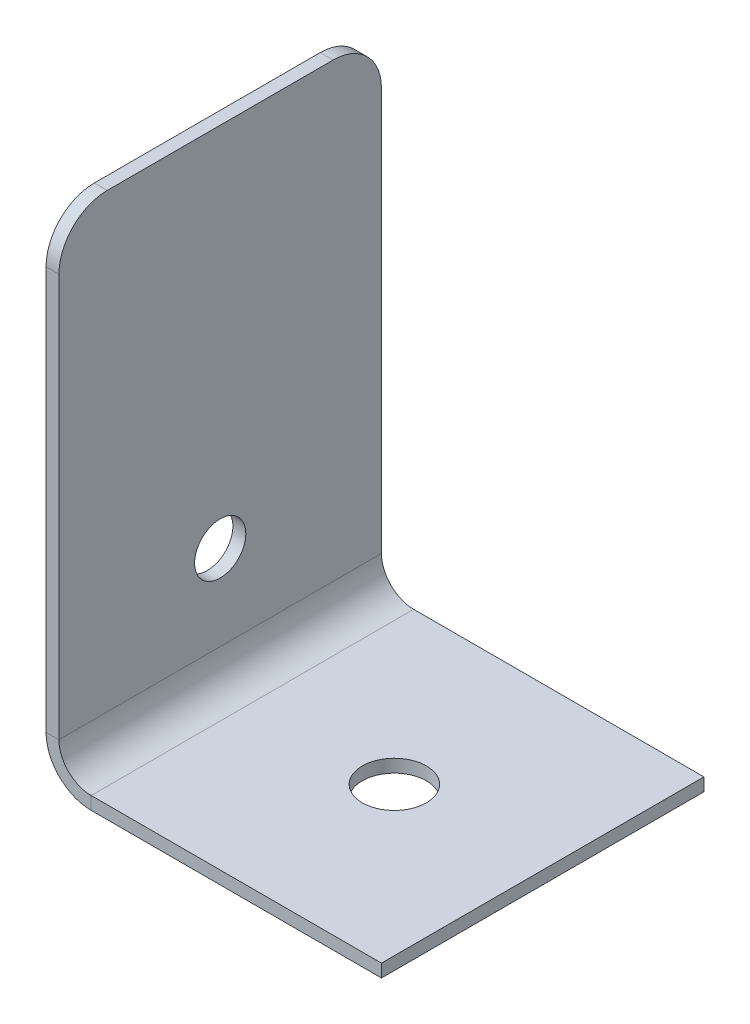
ISO-10303-21;
HEADER;
FILE_DESCRIPTION(('STEP AP214'),'2;1');
FILE_NAME('part.step','',(''),(''),'','','');
FILE_SCHEMA(('AUTOMOTIVE_DESIGN { 1 0 10303 214 1 1 1 1 }'));
ENDSEC;
DATA;
#1=APPLICATION_CONTEXT('core data for automotive mechanical design processes');
#2=APPLICATION_PROTOCOL_DEFINITION('international standard','automotive_design',2000,#1);
#3=PRODUCT_CONTEXT('',#1,'mechanical');
#4=PRODUCT('Part','Part','',(#3));
#5=PRODUCT_RELATED_PRODUCT_CATEGORY('part','',(#4));
#6=PRODUCT_DEFINITION_FORMATION('','',#4);
#7=PRODUCT_DEFINITION_CONTEXT('part definition',#1,'design');
#8=PRODUCT_DEFINITION('design','',#6,#7);
#9=PRODUCT_DEFINITION_SHAPE('','',#8);
#10=(LENGTH_UNIT() NAMED_UNIT(*) SI_UNIT(.MILLI.,.METRE.));
#11=(NAMED_UNIT(*) PLANE_ANGLE_UNIT() SI_UNIT($,.RADIAN.));
#12=(NAMED_UNIT(*) SI_UNIT($,.STERADIAN.) SOLID_ANGLE_UNIT());
#13=UNCERTAINTY_MEASURE_WITH_UNIT(LENGTH_MEASURE(1.E-05),#10,'distance_accuracy_value','');
#14=(GEOMETRIC_REPRESENTATION_CONTEXT(3) GLOBAL_UNCERTAINTY_ASSIGNED_CONTEXT((#13)) GLOBAL_UNIT_ASSIGNED_CONTEXT((#10,
#11,#12)) REPRESENTATION_CONTEXT('',''));
#15=CARTESIAN_POINT('',(0.,0.,0.));
#16=DIRECTION('',(0.,0.,1.));
#17=DIRECTION('',(1.,0.,0.));
#18=AXIS2_PLACEMENT_3D('',#15,#16,#17);
#19=CARTESIAN_POINT('',(2.00000000000001,0.,9.99999999999999));
#20=DIRECTION('',(0.,0.,1.));
#21=DIRECTION('',(1.,0.,0.));
#22=AXIS2_PLACEMENT_3D('',#19,#20,#21);
#23=PLANE('',#22);
#24=DIRECTION('',(0.,-1.,0.));
#25=VECTOR('',#24,1.);
#26=CARTESIAN_POINT('',(2.00000000000001,0.,9.99999999999999));
#27=LINE('',#26,#25);
#28=CARTESIAN_POINT('',(2.00000000000001,0.,9.99999999999999));
#29=VERTEX_POINT('',#28);
#30=CARTESIAN_POINT('',(2.00000000000001,-0.799999999999998,9.99999999999999));
#31=VERTEX_POINT('',#30);
#32=EDGE_CURVE('E197',#29,#31,#27,.T.);
#33=ORIENTED_EDGE('',*,*,#32,.F.);
#34=CARTESIAN_POINT('',(2.00000000000001,2.,9.99999999999999));
#35=DIRECTION('',(0.,0.,-1.));
#36=DIRECTION('',(-1.,0.,0.));
#37=AXIS2_PLACEMENT_3D('',#34,#35,#36);
#38=CIRCLE('',#37,2.);
#39=CARTESIAN_POINT('',(0.,2.,9.99999999999999));
#40=VERTEX_POINT('',#39);
#41=EDGE_CURVE('E165',#40,#29,#38,.F.);
#42=ORIENTED_EDGE('',*,*,#41,.F.);
#43=DIRECTION('',(1.,0.,0.));
#44=VECTOR('',#43,1.);
#45=CARTESIAN_POINT('',(-0.799999999999999,2.,9.99999999999999));
#46=LINE('',#45,#44);
#47=CARTESIAN_POINT('',(-0.799999999999999,2.,9.99999999999999));
#48=VERTEX_POINT('',#47);
#49=EDGE_CURVE('E194',#48,#40,#46,.T.);
#50=ORIENTED_EDGE('',*,*,#49,.F.);
#51=CARTESIAN_POINT('',(2.00000000000001,2.,9.99999999999999));
#52=DIRECTION('',(0.,0.,1.));
#53=DIRECTION('',(1.,0.,0.));
#54=AXIS2_PLACEMENT_3D('',#51,#52,#53);
#55=CIRCLE('',#54,2.8);
#56=EDGE_CURVE('E172',#48,#31,#55,.T.);
#57=ORIENTED_EDGE('',*,*,#56,.T.);
#58=EDGE_LOOP('',(#33,#42,#50,#57));
#59=FACE_BOUND('',#58,.T.);
#60=ADVANCED_FACE('F38',(#59),#23,.T.);
#61=CARTESIAN_POINT('',(-0.799999999999999,2.,9.99999999999999));
#62=DIRECTION('',(0.,0.,1.));
#63=DIRECTION('',(1.,0.,0.));
#64=AXIS2_PLACEMENT_3D('',#61,#62,#63);
#65=PLANE('',#64);
#66=DIRECTION('',(1.,0.,0.));
#67=VECTOR('',#66,1.);
#68=CARTESIAN_POINT('',(0.,0.,9.99999999999999));
#69=LINE('',#68,#67);
#70=CARTESIAN_POINT('',(20.,0.,10.));
#71=VERTEX_POINT('',#70);
#72=EDGE_CURVE('E162',#29,#71,#69,.T.);
#73=ORIENTED_EDGE('',*,*,#72,.F.);
#74=ORIENTED_EDGE('',*,*,#32,.T.);
#75=DIRECTION('',(1.,0.,0.));
#76=VECTOR('',#75,1.);
#77=CARTESIAN_POINT('',(0.,-0.8,9.99999999999999));
#78=LINE('',#77,#76);
#79=CARTESIAN_POINT('',(20.,-0.799999999999988,10.));
#80=VERTEX_POINT('',#79);
#81=EDGE_CURVE('E159',#31,#80,#78,.T.);
#82=ORIENTED_EDGE('',*,*,#81,.T.);
#83=DIRECTION('',(0.,-1.,0.));
#84=VECTOR('',#83,1.);
#85=CARTESIAN_POINT('',(20.,0.,10.));
#86=LINE('',#85,#84);
#87=EDGE_CURVE('E122',#71,#80,#86,.T.);
#88=ORIENTED_EDGE('',*,*,#87,.F.);
#89=EDGE_LOOP('',(#73,#74,#82,#88));
#90=FACE_BOUND('',#89,.T.);
#91=ADVANCED_FACE('F244',(#90),#65,.T.);
#92=CARTESIAN_POINT('',(0.,2.,-9.99999999999999));
#93=DIRECTION('',(0.,0.,-1.));
#94=DIRECTION('',(-1.,0.,0.));
#95=AXIS2_PLACEMENT_3D('',#92,#93,#94);
#96=PLANE('',#95);
#97=DIRECTION('',(-1.,0.,0.));
#98=VECTOR('',#97,1.);
#99=CARTESIAN_POINT('',(0.,2.,-9.99999999999999));
#100=LINE('',#99,#98);
#101=CARTESIAN_POINT('',(0.,2.,-9.99999999999999));
#102=VERTEX_POINT('',#101);
#103=CARTESIAN_POINT('',(-0.799999999999999,2.,-9.99999999999999));
#104=VERTEX_POINT('',#103);
#105=EDGE_CURVE('E191',#102,#104,#100,.T.);
#106=ORIENTED_EDGE('',*,*,#105,.F.);
#107=CARTESIAN_POINT('',(2.00000000000001,2.,-9.99999999999999));
#108=DIRECTION('',(0.,0.,-1.));
#109=DIRECTION('',(-1.,0.,0.));
#110=AXIS2_PLACEMENT_3D('',#107,#108,#109);
#111=CIRCLE('',#110,2.);
#112=CARTESIAN_POINT('',(2.00000000000001,0.,-9.99999999999999));
#113=VERTEX_POINT('',#112);
#114=EDGE_CURVE('E150',#102,#113,#111,.F.);
#115=ORIENTED_EDGE('',*,*,#114,.T.);
#116=DIRECTION('',(0.,1.,0.));
#117=VECTOR('',#116,1.);
#118=CARTESIAN_POINT('',(2.00000000000001,-0.799999999999999,-9.99999999999999));
#119=LINE('',#118,#117);
#120=CARTESIAN_POINT('',(2.00000000000001,-0.799999999999999,-9.99999999999999));
#121=VERTEX_POINT('',#120);
#122=EDGE_CURVE('E126',#121,#113,#119,.T.);
#123=ORIENTED_EDGE('',*,*,#122,.F.);
#124=CARTESIAN_POINT('',(2.00000000000001,2.,-9.99999999999999));
#125=DIRECTION('',(0.,0.,1.));
#126=DIRECTION('',(1.,0.,0.));
#127=AXIS2_PLACEMENT_3D('',#124,#125,#126);
#128=CIRCLE('',#127,2.8);
#129=EDGE_CURVE('E157',#104,#121,#128,.T.);
#130=ORIENTED_EDGE('',*,*,#129,.F.);
#131=EDGE_LOOP('',(#106,#115,#123,#130));
#132=FACE_BOUND('',#131,.T.);
#133=ADVANCED_FACE('F246',(#132),#96,.T.);
#134=CARTESIAN_POINT('',(2.00000000000001,-0.799999999999999,-9.99999999999999));
#135=DIRECTION('',(0.,0.,-1.));
#136=DIRECTION('',(-1.,0.,0.));
#137=AXIS2_PLACEMENT_3D('',#134,#135,#136);
#138=PLANE('',#137);
#139=DIRECTION('',(0.,-1.,0.));
#140=VECTOR('',#139,1.);
#141=CARTESIAN_POINT('',(-0.799999999999981,30.,-9.99999999999999));
#142=LINE('',#141,#140);
#143=CARTESIAN_POINT('',(-0.799999999999981,27.,-9.99999999999999));
#144=VERTEX_POINT('',#143);
#145=EDGE_CURVE('E155',#144,#104,#142,.T.);
#146=ORIENTED_EDGE('',*,*,#145,.F.);
#147=DIRECTION('',(1.,0.,0.));
#148=VECTOR('',#147,1.);
#149=CARTESIAN_POINT('',(2.00000000000003,27.,-9.99999999999999));
#150=LINE('',#149,#148);
#151=CARTESIAN_POINT('',(0.,27.,-9.99999999999999));
#152=VERTEX_POINT('',#151);
#153=EDGE_CURVE('E199',#144,#152,#150,.T.);
#154=ORIENTED_EDGE('',*,*,#153,.T.);
#155=DIRECTION('',(0.,-1.,0.));
#156=VECTOR('',#155,1.);
#157=CARTESIAN_POINT('',(0.,30.,-9.99999999999999));
#158=LINE('',#157,#156);
#159=EDGE_CURVE('E153',#152,#102,#158,.T.);
#160=ORIENTED_EDGE('',*,*,#159,.T.);
#161=ORIENTED_EDGE('',*,*,#105,.T.);
#162=EDGE_LOOP('',(#146,#154,#160,#161));
#163=FACE_BOUND('',#162,.T.);
#164=ADVANCED_FACE('F219',(#163),#138,.T.);
#165=CARTESIAN_POINT('',(0.,-0.8,9.99999999999999));
#166=DIRECTION('',(0.,1.,0.));
#167=DIRECTION('',(0.,0.,1.));
#168=AXIS2_PLACEMENT_3D('',#165,#166,#167);
#169=PLANE('',#168);
#170=CARTESIAN_POINT('',(10.8,-0.799999999999994,0.));
#171=DIRECTION('',(0.,1.,0.));
#172=DIRECTION('',(0.,0.,1.));
#173=AXIS2_PLACEMENT_3D('',#170,#171,#172);
#174=CIRCLE('',#173,1.984375);
#175=CARTESIAN_POINT('',(10.8,-0.799999999999994,1.984375));
#176=VERTEX_POINT('',#175);
#177=EDGE_CURVE('E435',#176,#176,#174,.T.);
#178=ORIENTED_EDGE('',*,*,#177,.T.);
#179=EDGE_LOOP('',(#178));
#180=FACE_BOUND('',#179,.T.);
#181=DIRECTION('',(0.,0.,-1.));
#182=VECTOR('',#181,1.);
#183=CARTESIAN_POINT('',(2.00000000000001,-0.799999999999998,9.99999999999999));
#184=LINE('',#183,#182);
#185=EDGE_CURVE('E141',#31,#121,#184,.T.);
#186=ORIENTED_EDGE('',*,*,#185,.T.);
#187=DIRECTION('',(1.,0.,0.));
#188=VECTOR('',#187,1.);
#189=CARTESIAN_POINT('',(0.,-0.800000000000001,-9.99999999999999));
#190=LINE('',#189,#188);
#191=CARTESIAN_POINT('',(20.,-0.799999999999989,-9.99999999999999));
#192=VERTEX_POINT('',#191);
#193=EDGE_CURVE('E133',#121,#192,#190,.T.);
#194=ORIENTED_EDGE('',*,*,#193,.T.);
#195=DIRECTION('',(0.,0.,-1.));
#196=VECTOR('',#195,1.);
#197=CARTESIAN_POINT('',(20.,-0.799999999999988,10.));
#198=LINE('',#197,#196);
#199=EDGE_CURVE('E117',#80,#192,#198,.T.);
#200=ORIENTED_EDGE('',*,*,#199,.F.);
#201=ORIENTED_EDGE('',*,*,#81,.F.);
#202=EDGE_LOOP('',(#186,#194,#200,#201));
#203=FACE_BOUND('',#202,.T.);
#204=ADVANCED_FACE('F139',(#180,#203),#169,.F.);
#205=CARTESIAN_POINT('',(20.,0.,10.));
#206=DIRECTION('',(1.,0.,0.));
#207=DIRECTION('',(0.,0.,-1.));
#208=AXIS2_PLACEMENT_3D('',#205,#206,#207);
#209=PLANE('',#208);
#210=ORIENTED_EDGE('',*,*,#199,.T.);
#211=DIRECTION('',(0.,-1.,0.));
#212=VECTOR('',#211,1.);
#213=CARTESIAN_POINT('',(20.,0.,-9.99999999999999));
#214=LINE('',#213,#212);
#215=CARTESIAN_POINT('',(20.,0.,-9.99999999999999));
#216=VERTEX_POINT('',#215);
#217=EDGE_CURVE('E120',#216,#192,#214,.T.);
#218=ORIENTED_EDGE('',*,*,#217,.F.);
#219=DIRECTION('',(0.,0.,-1.));
#220=VECTOR('',#219,1.);
#221=CARTESIAN_POINT('',(20.,0.,10.));
#222=LINE('',#221,#220);
#223=EDGE_CURVE('E127',#71,#216,#222,.T.);
#224=ORIENTED_EDGE('',*,*,#223,.F.);
#225=ORIENTED_EDGE('',*,*,#87,.T.);
#226=EDGE_LOOP('',(#210,#218,#224,#225));
#227=FACE_BOUND('',#226,.T.);
#228=ADVANCED_FACE('F119',(#227),#209,.T.);
#229=CARTESIAN_POINT('',(0.,0.,9.99999999999999));
#230=DIRECTION('',(0.,1.,0.));
#231=DIRECTION('',(0.,0.,1.));
#232=AXIS2_PLACEMENT_3D('',#229,#230,#231);
#233=PLANE('',#232);
#234=CARTESIAN_POINT('',(10.8,0.,0.));
#235=DIRECTION('',(0.,1.,0.));
#236=DIRECTION('',(0.,0.,1.));
#237=AXIS2_PLACEMENT_3D('',#234,#235,#236);
#238=CIRCLE('',#237,1.984375);
#239=CARTESIAN_POINT('',(10.8,0.,1.984375));
#240=VERTEX_POINT('',#239);
#241=EDGE_CURVE('E436',#240,#240,#238,.T.);
#242=ORIENTED_EDGE('',*,*,#241,.F.);
#243=EDGE_LOOP('',(#242));
#244=FACE_BOUND('',#243,.T.);
#245=ORIENTED_EDGE('',*,*,#223,.T.);
#246=DIRECTION('',(1.,0.,0.));
#247=VECTOR('',#246,1.);
#248=CARTESIAN_POINT('',(0.,0.,-9.99999999999999));
#249=LINE('',#248,#247);
#250=EDGE_CURVE('E136',#113,#216,#249,.T.);
#251=ORIENTED_EDGE('',*,*,#250,.F.);
#252=DIRECTION('',(0.,0.,-1.));
#253=VECTOR('',#252,1.);
#254=CARTESIAN_POINT('',(2.00000000000001,0.,9.99999999999999));
#255=LINE('',#254,#253);
#256=EDGE_CURVE('E186',#29,#113,#255,.T.);
#257=ORIENTED_EDGE('',*,*,#256,.F.);
#258=ORIENTED_EDGE('',*,*,#72,.T.);
#259=EDGE_LOOP('',(#245,#251,#257,#258));
#260=FACE_BOUND('',#259,.T.);
#261=ADVANCED_FACE('F243',(#244,#260),#233,.T.);
#262=CARTESIAN_POINT('',(2.00000000000001,2.,9.99999999999999));
#263=DIRECTION('',(0.,0.,-1.));
#264=DIRECTION('',(-1.,0.,0.));
#265=AXIS2_PLACEMENT_3D('',#262,#263,#264);
#266=CYLINDRICAL_SURFACE('',#265,2.);
#267=ORIENTED_EDGE('',*,*,#256,.T.);
#268=ORIENTED_EDGE('',*,*,#114,.F.);
#269=DIRECTION('',(0.,0.,-1.));
#270=VECTOR('',#269,1.);
#271=CARTESIAN_POINT('',(0.,2.,9.99999999999999));
#272=LINE('',#271,#270);
#273=EDGE_CURVE('E183',#40,#102,#272,.T.);
#274=ORIENTED_EDGE('',*,*,#273,.F.);
#275=ORIENTED_EDGE('',*,*,#41,.T.);
#276=EDGE_LOOP('',(#267,#268,#274,#275));
#277=FACE_BOUND('',#276,.T.);
#278=ADVANCED_FACE('F237',(#277),#266,.F.);
#279=CARTESIAN_POINT('',(0.,30.,9.99999999999999));
#280=DIRECTION('',(1.,0.,0.));
#281=DIRECTION('',(0.,1.,0.));
#282=AXIS2_PLACEMENT_3D('',#279,#280,#281);
#283=PLANE('',#282);
#284=CARTESIAN_POINT('',(0.,7.27,0.));
#285=DIRECTION('',(1.,0.,0.));
#286=DIRECTION('',(0.,1.,0.));
#287=AXIS2_PLACEMENT_3D('',#284,#285,#286);
#288=CIRCLE('',#287,1.5875);
#289=CARTESIAN_POINT('',(0.,8.8575,0.));
#290=VERTEX_POINT('',#289);
#291=EDGE_CURVE('E145',#290,#290,#288,.T.);
#292=ORIENTED_EDGE('',*,*,#291,.F.);
#293=EDGE_LOOP('',(#292));
#294=FACE_BOUND('',#293,.T.);
#295=ORIENTED_EDGE('',*,*,#159,.F.);
#296=CARTESIAN_POINT('',(0.,27.,-7.00000000000001));
#297=DIRECTION('',(1.,0.,0.));
#298=DIRECTION('',(0.,1.,0.));
#299=AXIS2_PLACEMENT_3D('',#296,#297,#298);
#300=CIRCLE('',#299,3.);
#301=CARTESIAN_POINT('',(0.,30.,-7.00000000000001));
#302=VERTEX_POINT('',#301);
#303=EDGE_CURVE('E204',#152,#302,#300,.T.);
#304=ORIENTED_EDGE('',*,*,#303,.T.);
#305=DIRECTION('',(0.,0.,-1.));
#306=VECTOR('',#305,1.);
#307=CARTESIAN_POINT('',(0.,30.,9.99999999999999));
#308=LINE('',#307,#306);
#309=CARTESIAN_POINT('',(0.,30.,7.00000000000001));
#310=VERTEX_POINT('',#309);
#311=EDGE_CURVE('E181',#310,#302,#308,.T.);
#312=ORIENTED_EDGE('',*,*,#311,.F.);
#313=CARTESIAN_POINT('',(0.,27.,7.00000000000001));
#314=DIRECTION('',(1.,0.,0.));
#315=DIRECTION('',(0.,1.,0.));
#316=AXIS2_PLACEMENT_3D('',#313,#314,#315);
#317=CIRCLE('',#316,3.);
#318=CARTESIAN_POINT('',(0.,27.,9.99999999999999));
#319=VERTEX_POINT('',#318);
#320=EDGE_CURVE('E202',#310,#319,#317,.T.);
#321=ORIENTED_EDGE('',*,*,#320,.T.);
#322=DIRECTION('',(0.,-1.,0.));
#323=VECTOR('',#322,1.);
#324=CARTESIAN_POINT('',(0.,30.,9.99999999999999));
#325=LINE('',#324,#323);
#326=EDGE_CURVE('E168',#319,#40,#325,.T.);
#327=ORIENTED_EDGE('',*,*,#326,.T.);
#328=ORIENTED_EDGE('',*,*,#273,.T.);
#329=EDGE_LOOP('',(#295,#304,#312,#321,#327,#328));
#330=FACE_BOUND('',#329,.T.);
#331=ADVANCED_FACE('F225',(#294,#330),#283,.T.);
#332=CARTESIAN_POINT('',(-0.799999999999981,30.,9.99999999999999));
#333=DIRECTION('',(0.,1.,0.));
#334=DIRECTION('',(0.,0.,1.));
#335=AXIS2_PLACEMENT_3D('',#332,#333,#334);
#336=PLANE('',#335);
#337=ORIENTED_EDGE('',*,*,#311,.T.);
#338=DIRECTION('',(1.,0.,0.));
#339=VECTOR('',#338,1.);
#340=CARTESIAN_POINT('',(-0.799999999999981,30.,-7.00000000000001));
#341=LINE('',#340,#339);
#342=CARTESIAN_POINT('',(-0.799999999999981,30.,-7.00000000000001));
#343=VERTEX_POINT('',#342);
#344=EDGE_CURVE('E59',#302,#343,#341,.F.);
#345=ORIENTED_EDGE('',*,*,#344,.T.);
#346=DIRECTION('',(0.,0.,-1.));
#347=VECTOR('',#346,1.);
#348=CARTESIAN_POINT('',(-0.799999999999981,30.,9.99999999999999));
#349=LINE('',#348,#347);
#350=CARTESIAN_POINT('',(-0.799999999999981,30.,7.00000000000001));
#351=VERTEX_POINT('',#350);
#352=EDGE_CURVE('E179',#351,#343,#349,.T.);
#353=ORIENTED_EDGE('',*,*,#352,.F.);
#354=DIRECTION('',(1.,0.,0.));
#355=VECTOR('',#354,1.);
#356=CARTESIAN_POINT('',(0.,30.,7.00000000000001));
#357=LINE('',#356,#355);
#358=EDGE_CURVE('E206',#351,#310,#357,.T.);
#359=ORIENTED_EDGE('',*,*,#358,.T.);
#360=EDGE_LOOP('',(#337,#345,#353,#359));
#361=FACE_BOUND('',#360,.T.);
#362=ADVANCED_FACE('F226',(#361),#336,.T.);
#363=CARTESIAN_POINT('',(-0.799999999999981,30.,9.99999999999999));
#364=DIRECTION('',(1.,0.,0.));
#365=DIRECTION('',(0.,1.,0.));
#366=AXIS2_PLACEMENT_3D('',#363,#364,#365);
#367=PLANE('',#366);
#368=CARTESIAN_POINT('',(-0.800000000000002,7.27,0.));
#369=DIRECTION('',(1.,0.,0.));
#370=DIRECTION('',(0.,1.,0.));
#371=AXIS2_PLACEMENT_3D('',#368,#369,#370);
#372=CIRCLE('',#371,1.5875);
#373=CARTESIAN_POINT('',(-0.800000000000001,8.8575,0.));
#374=VERTEX_POINT('',#373);
#375=EDGE_CURVE('E142',#374,#374,#372,.T.);
#376=ORIENTED_EDGE('',*,*,#375,.T.);
#377=EDGE_LOOP('',(#376));
#378=FACE_BOUND('',#377,.T.);
#379=ORIENTED_EDGE('',*,*,#352,.T.);
#380=CARTESIAN_POINT('',(-0.799999999999981,27.,-7.00000000000001));
#381=DIRECTION('',(1.,0.,0.));
#382=DIRECTION('',(0.,1.,0.));
#383=AXIS2_PLACEMENT_3D('',#380,#381,#382);
#384=CIRCLE('',#383,3.);
#385=EDGE_CURVE('E46',#343,#144,#384,.F.);
#386=ORIENTED_EDGE('',*,*,#385,.T.);
#387=ORIENTED_EDGE('',*,*,#145,.T.);
#388=DIRECTION('',(0.,0.,-1.));
#389=VECTOR('',#388,1.);
#390=CARTESIAN_POINT('',(-0.799999999999999,2.,9.99999999999999));
#391=LINE('',#390,#389);
#392=EDGE_CURVE('E176',#48,#104,#391,.T.);
#393=ORIENTED_EDGE('',*,*,#392,.F.);
#394=DIRECTION('',(0.,-1.,0.));
#395=VECTOR('',#394,1.);
#396=CARTESIAN_POINT('',(-0.799999999999981,30.,9.99999999999999));
#397=LINE('',#396,#395);
#398=CARTESIAN_POINT('',(-0.799999999999981,27.,9.99999999999999));
#399=VERTEX_POINT('',#398);
#400=EDGE_CURVE('E170',#399,#48,#397,.T.);
#401=ORIENTED_EDGE('',*,*,#400,.F.);
#402=CARTESIAN_POINT('',(-0.799999999999981,27.,7.00000000000001));
#403=DIRECTION('',(1.,0.,0.));
#404=DIRECTION('',(0.,1.,0.));
#405=AXIS2_PLACEMENT_3D('',#402,#403,#404);
#406=CIRCLE('',#405,3.);
#407=EDGE_CURVE('E210',#399,#351,#406,.F.);
#408=ORIENTED_EDGE('',*,*,#407,.T.);
#409=EDGE_LOOP('',(#379,#386,#387,#393,#401,#408));
#410=FACE_BOUND('',#409,.T.);
#411=ADVANCED_FACE('F214',(#378,#410),#367,.F.);
#412=CARTESIAN_POINT('',(2.00000000000001,2.,9.99999999999999));
#413=DIRECTION('',(0.,0.,-1.));
#414=DIRECTION('',(-1.,0.,0.));
#415=AXIS2_PLACEMENT_3D('',#412,#413,#414);
#416=CYLINDRICAL_SURFACE('',#415,2.8);
#417=ORIENTED_EDGE('',*,*,#392,.T.);
#418=ORIENTED_EDGE('',*,*,#129,.T.);
#419=ORIENTED_EDGE('',*,*,#185,.F.);
#420=ORIENTED_EDGE('',*,*,#56,.F.);
#421=EDGE_LOOP('',(#417,#418,#419,#420));
#422=FACE_BOUND('',#421,.T.);
#423=ADVANCED_FACE('F277',(#422),#416,.T.);
#424=CARTESIAN_POINT('',(2.00000000000001,2.,9.99999999999999));
#425=DIRECTION('',(0.,0.,-1.));
#426=DIRECTION('',(-1.,0.,0.));
#427=AXIS2_PLACEMENT_3D('',#424,#425,#426);
#428=PLANE('',#427);
#429=ORIENTED_EDGE('',*,*,#326,.F.);
#430=DIRECTION('',(1.,0.,0.));
#431=VECTOR('',#430,1.);
#432=CARTESIAN_POINT('',(-0.799999999999981,27.,9.99999999999999));
#433=LINE('',#432,#431);
#434=EDGE_CURVE('E11',#319,#399,#433,.F.);
#435=ORIENTED_EDGE('',*,*,#434,.T.);
#436=ORIENTED_EDGE('',*,*,#400,.T.);
#437=ORIENTED_EDGE('',*,*,#49,.T.);
#438=EDGE_LOOP('',(#429,#435,#436,#437));
#439=FACE_BOUND('',#438,.T.);
#440=ADVANCED_FACE('F230',(#439),#428,.F.);
#441=CARTESIAN_POINT('',(2.00000000000001,2.,-9.99999999999999));
#442=DIRECTION('',(0.,0.,-1.));
#443=DIRECTION('',(-1.,0.,0.));
#444=AXIS2_PLACEMENT_3D('',#441,#442,#443);
#445=PLANE('',#444);
#446=ORIENTED_EDGE('',*,*,#193,.F.);
#447=ORIENTED_EDGE('',*,*,#122,.T.);
#448=ORIENTED_EDGE('',*,*,#250,.T.);
#449=ORIENTED_EDGE('',*,*,#217,.T.);
#450=EDGE_LOOP('',(#446,#447,#448,#449));
#451=FACE_BOUND('',#450,.T.);
#452=ADVANCED_FACE('F132',(#451),#445,.T.);
#453=CARTESIAN_POINT('',(-0.800000000000002,7.27,0.));
#454=DIRECTION('',(1.,0.,0.));
#455=DIRECTION('',(0.,1.,0.));
#456=AXIS2_PLACEMENT_3D('',#453,#454,#455);
#457=CYLINDRICAL_SURFACE('',#456,1.5875);
#458=ORIENTED_EDGE('',*,*,#375,.F.);
#459=EDGE_LOOP('',(#458));
#460=FACE_BOUND('',#459,.T.);
#461=ORIENTED_EDGE('',*,*,#291,.T.);
#462=EDGE_LOOP('',(#461));
#463=FACE_BOUND('',#462,.T.);
#464=ADVANCED_FACE('F262',(#460,#463),#457,.F.);
#465=CARTESIAN_POINT('',(10.8,-9.99999999999999,0.));
#466=DIRECTION('',(0.,1.,0.));
#467=DIRECTION('',(0.,0.,1.));
#468=AXIS2_PLACEMENT_3D('',#465,#466,#467);
#469=CYLINDRICAL_SURFACE('',#468,1.984375);
#470=ORIENTED_EDGE('',*,*,#241,.T.);
#471=EDGE_LOOP('',(#470));
#472=FACE_BOUND('',#471,.T.);
#473=ORIENTED_EDGE('',*,*,#177,.F.);
#474=EDGE_LOOP('',(#473));
#475=FACE_BOUND('',#474,.T.);
#476=ADVANCED_FACE('F257',(#472,#475),#469,.F.);
#477=CARTESIAN_POINT('',(2.00000000000003,27.,-7.00000000000001));
#478=DIRECTION('',(1.,0.,0.));
#479=DIRECTION('',(0.,0.,-1.));
#480=AXIS2_PLACEMENT_3D('',#477,#478,#479);
#481=CYLINDRICAL_SURFACE('',#480,3.);
#482=ORIENTED_EDGE('',*,*,#385,.F.);
#483=ORIENTED_EDGE('',*,*,#344,.F.);
#484=ORIENTED_EDGE('',*,*,#303,.F.);
#485=ORIENTED_EDGE('',*,*,#153,.F.);
#486=EDGE_LOOP('',(#482,#483,#484,#485));
#487=FACE_BOUND('',#486,.T.);
#488=ADVANCED_FACE('F222',(#487),#481,.T.);
#489=CARTESIAN_POINT('',(-0.799999999999981,27.,7.00000000000001));
#490=DIRECTION('',(-1.,0.,0.));
#491=DIRECTION('',(0.,0.,1.));
#492=AXIS2_PLACEMENT_3D('',#489,#490,#491);
#493=CYLINDRICAL_SURFACE('',#492,3.);
#494=ORIENTED_EDGE('',*,*,#407,.F.);
#495=ORIENTED_EDGE('',*,*,#434,.F.);
#496=ORIENTED_EDGE('',*,*,#320,.F.);
#497=ORIENTED_EDGE('',*,*,#358,.F.);
#498=EDGE_LOOP('',(#494,#495,#496,#497));
#499=FACE_BOUND('',#498,.T.);
#500=ADVANCED_FACE('F40',(#499),#493,.T.);
#501=CLOSED_SHELL('',(#60,#91,#133,#164,#204,#228,#261,#278,#331,#362,#411,#423,#440,#452,#464,
#476,#488,#500));
#502=MANIFOLD_SOLID_BREP('B2',#501);
#503=ADVANCED_BREP_SHAPE_REPRESENTATION('',(#18,#502),#14);
#504=SHAPE_DEFINITION_REPRESENTATION(#9,#503);
ENDSEC;
END-ISO-10303-21;
